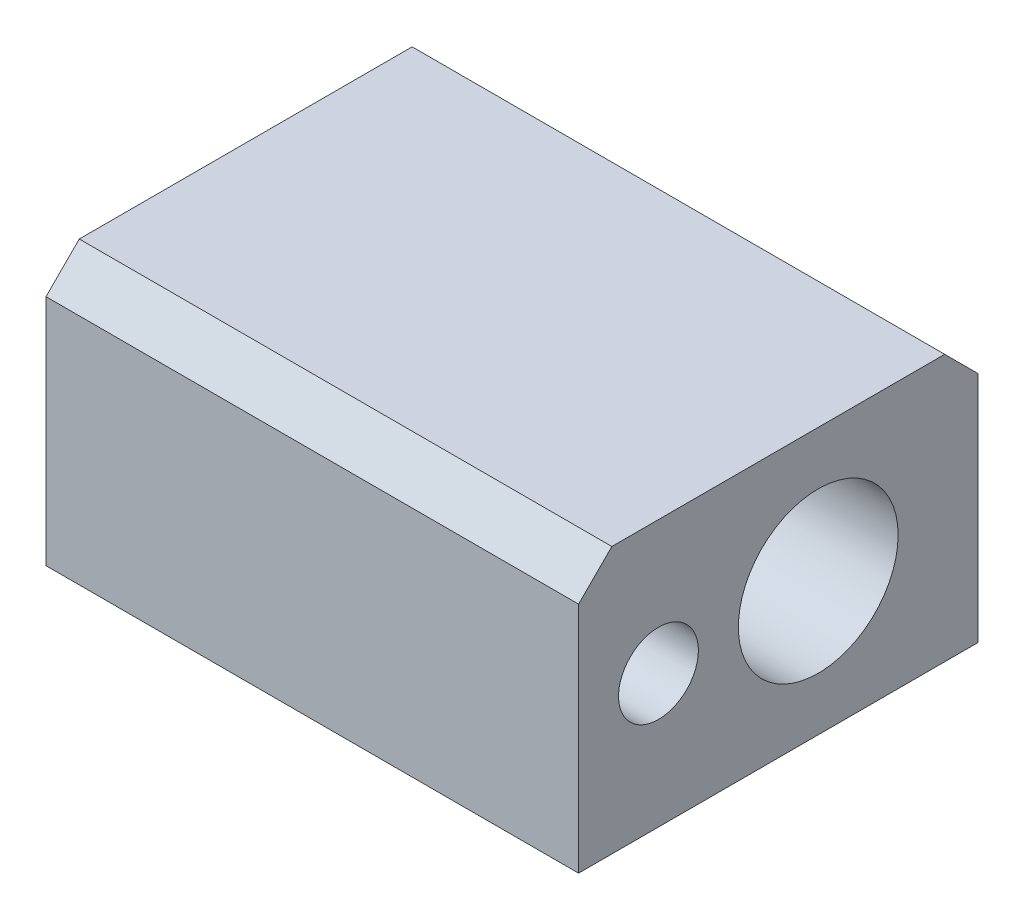
ISO-10303-21;
HEADER;
FILE_DESCRIPTION(('STEP AP214'),'2;1');
FILE_NAME('part.step','',(''),(''),'','','');
FILE_SCHEMA(('AUTOMOTIVE_DESIGN { 1 0 10303 214 1 1 1 1 }'));
ENDSEC;
DATA;
#1=APPLICATION_CONTEXT('core data for automotive mechanical design processes');
#2=APPLICATION_PROTOCOL_DEFINITION('international standard','automotive_design',2000,#1);
#3=PRODUCT_CONTEXT('',#1,'mechanical');
#4=PRODUCT('Part','Part','',(#3));
#5=PRODUCT_RELATED_PRODUCT_CATEGORY('part','',(#4));
#6=PRODUCT_DEFINITION_FORMATION('','',#4);
#7=PRODUCT_DEFINITION_CONTEXT('part definition',#1,'design');
#8=PRODUCT_DEFINITION('design','',#6,#7);
#9=PRODUCT_DEFINITION_SHAPE('','',#8);
#10=(LENGTH_UNIT() NAMED_UNIT(*) SI_UNIT(.MILLI.,.METRE.));
#11=(NAMED_UNIT(*) PLANE_ANGLE_UNIT() SI_UNIT($,.RADIAN.));
#12=(NAMED_UNIT(*) SI_UNIT($,.STERADIAN.) SOLID_ANGLE_UNIT());
#13=UNCERTAINTY_MEASURE_WITH_UNIT(LENGTH_MEASURE(1.E-05),#10,'distance_accuracy_value','');
#14=(GEOMETRIC_REPRESENTATION_CONTEXT(3) GLOBAL_UNCERTAINTY_ASSIGNED_CONTEXT((#13)) GLOBAL_UNIT_ASSIGNED_CONTEXT((#10,
#11,#12)) REPRESENTATION_CONTEXT('',''));
#15=CARTESIAN_POINT('',(0.,0.,0.));
#16=DIRECTION('',(0.,0.,1.));
#17=DIRECTION('',(1.,0.,0.));
#18=AXIS2_PLACEMENT_3D('',#15,#16,#17);
#19=CARTESIAN_POINT('',(101.6,0.,0.));
#20=DIRECTION('',(1.,0.,0.));
#21=DIRECTION('',(0.,0.,-1.));
#22=AXIS2_PLACEMENT_3D('',#19,#20,#21);
#23=PLANE('',#22);
#24=CARTESIAN_POINT('',(101.6,0.,-7.62000000000001));
#25=DIRECTION('',(1.,0.,0.));
#26=DIRECTION('',(0.,0.,-1.));
#27=AXIS2_PLACEMENT_3D('',#24,#25,#26);
#28=CIRCLE('',#27,15.24);
#29=CARTESIAN_POINT('',(101.6,0.,-22.86));
#30=VERTEX_POINT('',#29);
#31=EDGE_CURVE('E170',#30,#30,#28,.T.);
#32=ORIENTED_EDGE('',*,*,#31,.F.);
#33=EDGE_LOOP('',(#32));
#34=FACE_BOUND('',#33,.T.);
#35=DIRECTION('',(0.,1.,0.));
#36=VECTOR('',#35,1.);
#37=CARTESIAN_POINT('',(101.6,25.4,-38.1));
#38=LINE('',#37,#36);
#39=CARTESIAN_POINT('',(101.6,-25.4,-38.1));
#40=VERTEX_POINT('',#39);
#41=CARTESIAN_POINT('',(101.6,19.05,-38.1));
#42=VERTEX_POINT('',#41);
#43=EDGE_CURVE('E102',#40,#42,#38,.T.);
#44=ORIENTED_EDGE('',*,*,#43,.T.);
#45=DIRECTION('',(0.,-0.70710678118655,-0.707106781186545));
#46=VECTOR('',#45,1.);
#47=CARTESIAN_POINT('',(101.6,28.5749999999999,-28.5750000000001));
#48=LINE('',#47,#46);
#49=CARTESIAN_POINT('',(101.6,25.4,-31.75));
#50=VERTEX_POINT('',#49);
#51=EDGE_CURVE('E57',#42,#50,#48,.F.);
#52=ORIENTED_EDGE('',*,*,#51,.T.);
#53=DIRECTION('',(0.,0.,1.));
#54=VECTOR('',#53,1.);
#55=CARTESIAN_POINT('',(101.6,25.4,-38.1));
#56=LINE('',#55,#54);
#57=CARTESIAN_POINT('',(101.6,25.4,31.75));
#58=VERTEX_POINT('',#57);
#59=EDGE_CURVE('E110',#50,#58,#56,.T.);
#60=ORIENTED_EDGE('',*,*,#59,.T.);
#61=DIRECTION('',(0.,0.707106781186546,-0.707106781186549));
#62=VECTOR('',#61,1.);
#63=CARTESIAN_POINT('',(101.6,28.5750000000001,28.5749999999999));
#64=LINE('',#63,#62);
#65=CARTESIAN_POINT('',(101.6,19.05,38.1));
#66=VERTEX_POINT('',#65);
#67=EDGE_CURVE('E64',#58,#66,#64,.F.);
#68=ORIENTED_EDGE('',*,*,#67,.T.);
#69=DIRECTION('',(0.,-1.,0.));
#70=VECTOR('',#69,1.);
#71=CARTESIAN_POINT('',(101.6,25.4,38.1));
#72=LINE('',#71,#70);
#73=CARTESIAN_POINT('',(101.6,-25.4,38.1));
#74=VERTEX_POINT('',#73);
#75=EDGE_CURVE('E115',#66,#74,#72,.T.);
#76=ORIENTED_EDGE('',*,*,#75,.T.);
#77=DIRECTION('',(0.,0.,-1.));
#78=VECTOR('',#77,1.);
#79=CARTESIAN_POINT('',(101.6,-25.4,-38.1));
#80=LINE('',#79,#78);
#81=EDGE_CURVE('E111',#74,#40,#80,.T.);
#82=ORIENTED_EDGE('',*,*,#81,.T.);
#83=EDGE_LOOP('',(#44,#52,#60,#68,#76,#82));
#84=FACE_BOUND('',#83,.T.);
#85=CARTESIAN_POINT('',(101.6,0.,22.86));
#86=DIRECTION('',(1.,0.,0.));
#87=DIRECTION('',(0.,0.,-1.));
#88=AXIS2_PLACEMENT_3D('',#85,#86,#87);
#89=CIRCLE('',#88,7.62);
#90=CARTESIAN_POINT('',(101.6,0.,15.24));
#91=VERTEX_POINT('',#90);
#92=EDGE_CURVE('E271',#91,#91,#89,.T.);
#93=ORIENTED_EDGE('',*,*,#92,.F.);
#94=EDGE_LOOP('',(#93));
#95=FACE_BOUND('',#94,.T.);
#96=ADVANCED_FACE('F47',(#34,#84,#95),#23,.T.);
#97=CARTESIAN_POINT('',(0.,0.,0.));
#98=DIRECTION('',(1.,0.,0.));
#99=DIRECTION('',(0.,0.,-1.));
#100=AXIS2_PLACEMENT_3D('',#97,#98,#99);
#101=PLANE('',#100);
#102=DIRECTION('',(0.,0.,1.));
#103=VECTOR('',#102,1.);
#104=CARTESIAN_POINT('',(0.,25.4,-38.1));
#105=LINE('',#104,#103);
#106=CARTESIAN_POINT('',(0.,25.4,-31.75));
#107=VERTEX_POINT('',#106);
#108=CARTESIAN_POINT('',(0.,25.4,31.75));
#109=VERTEX_POINT('',#108);
#110=EDGE_CURVE('E164',#107,#109,#105,.T.);
#111=ORIENTED_EDGE('',*,*,#110,.F.);
#112=DIRECTION('',(0.,0.70710678118655,0.707106781186545));
#113=VECTOR('',#112,1.);
#114=CARTESIAN_POINT('',(0.,25.4,-31.75));
#115=LINE('',#114,#113);
#116=CARTESIAN_POINT('',(0.,19.05,-38.1));
#117=VERTEX_POINT('',#116);
#118=EDGE_CURVE('E142',#107,#117,#115,.F.);
#119=ORIENTED_EDGE('',*,*,#118,.T.);
#120=DIRECTION('',(0.,1.,0.));
#121=VECTOR('',#120,1.);
#122=CARTESIAN_POINT('',(0.,25.4,-38.1));
#123=LINE('',#122,#121);
#124=CARTESIAN_POINT('',(0.,-25.4,-38.1));
#125=VERTEX_POINT('',#124);
#126=EDGE_CURVE('E163',#125,#117,#123,.T.);
#127=ORIENTED_EDGE('',*,*,#126,.F.);
#128=DIRECTION('',(0.,0.,-1.));
#129=VECTOR('',#128,1.);
#130=CARTESIAN_POINT('',(0.,-25.4,-38.1));
#131=LINE('',#130,#129);
#132=CARTESIAN_POINT('',(0.,-25.4,38.1));
#133=VERTEX_POINT('',#132);
#134=EDGE_CURVE('E124',#133,#125,#131,.T.);
#135=ORIENTED_EDGE('',*,*,#134,.F.);
#136=DIRECTION('',(0.,-1.,0.));
#137=VECTOR('',#136,1.);
#138=CARTESIAN_POINT('',(0.,25.4,38.1));
#139=LINE('',#138,#137);
#140=CARTESIAN_POINT('',(0.,19.05,38.1));
#141=VERTEX_POINT('',#140);
#142=EDGE_CURVE('E120',#141,#133,#139,.T.);
#143=ORIENTED_EDGE('',*,*,#142,.F.);
#144=DIRECTION('',(0.,-0.707106781186546,0.707106781186549));
#145=VECTOR('',#144,1.);
#146=CARTESIAN_POINT('',(0.,19.05,38.1));
#147=LINE('',#146,#145);
#148=EDGE_CURVE('E139',#141,#109,#147,.F.);
#149=ORIENTED_EDGE('',*,*,#148,.T.);
#150=EDGE_LOOP('',(#111,#119,#127,#135,#143,#149));
#151=FACE_BOUND('',#150,.T.);
#152=CARTESIAN_POINT('',(0.,0.,-7.62000000000001));
#153=DIRECTION('',(1.,0.,0.));
#154=DIRECTION('',(0.,0.,-1.));
#155=AXIS2_PLACEMENT_3D('',#152,#153,#154);
#156=CIRCLE('',#155,15.24);
#157=CARTESIAN_POINT('',(0.,0.,-22.86));
#158=VERTEX_POINT('',#157);
#159=EDGE_CURVE('E279',#158,#158,#156,.T.);
#160=ORIENTED_EDGE('',*,*,#159,.T.);
#161=EDGE_LOOP('',(#160));
#162=FACE_BOUND('',#161,.T.);
#163=CARTESIAN_POINT('',(0.,0.,22.86));
#164=DIRECTION('',(1.,0.,0.));
#165=DIRECTION('',(0.,0.,-1.));
#166=AXIS2_PLACEMENT_3D('',#163,#164,#165);
#167=CIRCLE('',#166,7.62);
#168=CARTESIAN_POINT('',(0.,0.,15.24));
#169=VERTEX_POINT('',#168);
#170=EDGE_CURVE('E274',#169,#169,#167,.T.);
#171=ORIENTED_EDGE('',*,*,#170,.T.);
#172=EDGE_LOOP('',(#171));
#173=FACE_BOUND('',#172,.T.);
#174=ADVANCED_FACE('F161',(#151,#162,#173),#101,.F.);
#175=CARTESIAN_POINT('',(101.6,-25.4,-38.1));
#176=DIRECTION('',(0.,1.,0.));
#177=DIRECTION('',(0.,0.,1.));
#178=AXIS2_PLACEMENT_3D('',#175,#176,#177);
#179=PLANE('',#178);
#180=ORIENTED_EDGE('',*,*,#134,.T.);
#181=DIRECTION('',(-1.,0.,0.));
#182=VECTOR('',#181,1.);
#183=CARTESIAN_POINT('',(101.6,-25.4,-38.1));
#184=LINE('',#183,#182);
#185=EDGE_CURVE('E106',#40,#125,#184,.T.);
#186=ORIENTED_EDGE('',*,*,#185,.F.);
#187=ORIENTED_EDGE('',*,*,#81,.F.);
#188=DIRECTION('',(-1.,0.,0.));
#189=VECTOR('',#188,1.);
#190=CARTESIAN_POINT('',(101.6,-25.4,38.1));
#191=LINE('',#190,#189);
#192=EDGE_CURVE('E127',#74,#133,#191,.T.);
#193=ORIENTED_EDGE('',*,*,#192,.T.);
#194=EDGE_LOOP('',(#180,#186,#187,#193));
#195=FACE_BOUND('',#194,.T.);
#196=ADVANCED_FACE('F122',(#195),#179,.F.);
#197=CARTESIAN_POINT('',(101.6,25.4,-38.1));
#198=DIRECTION('',(0.,0.,1.));
#199=DIRECTION('',(0.,-1.,0.));
#200=AXIS2_PLACEMENT_3D('',#197,#198,#199);
#201=PLANE('',#200);
#202=ORIENTED_EDGE('',*,*,#126,.T.);
#203=DIRECTION('',(1.,0.,0.));
#204=VECTOR('',#203,1.);
#205=CARTESIAN_POINT('',(101.6,19.05,-38.1));
#206=LINE('',#205,#204);
#207=EDGE_CURVE('E72',#117,#42,#206,.T.);
#208=ORIENTED_EDGE('',*,*,#207,.T.);
#209=ORIENTED_EDGE('',*,*,#43,.F.);
#210=ORIENTED_EDGE('',*,*,#185,.T.);
#211=EDGE_LOOP('',(#202,#208,#209,#210));
#212=FACE_BOUND('',#211,.T.);
#213=ADVANCED_FACE('F104',(#212),#201,.F.);
#214=CARTESIAN_POINT('',(101.6,25.4,-38.1));
#215=DIRECTION('',(0.,-1.,0.));
#216=DIRECTION('',(0.,0.,-1.));
#217=AXIS2_PLACEMENT_3D('',#214,#215,#216);
#218=PLANE('',#217);
#219=ORIENTED_EDGE('',*,*,#59,.F.);
#220=DIRECTION('',(-1.,0.,0.));
#221=VECTOR('',#220,1.);
#222=CARTESIAN_POINT('',(101.6,25.4,-31.75));
#223=LINE('',#222,#221);
#224=EDGE_CURVE('E131',#50,#107,#223,.T.);
#225=ORIENTED_EDGE('',*,*,#224,.T.);
#226=ORIENTED_EDGE('',*,*,#110,.T.);
#227=DIRECTION('',(1.,0.,0.));
#228=VECTOR('',#227,1.);
#229=CARTESIAN_POINT('',(101.6,25.4,31.75));
#230=LINE('',#229,#228);
#231=EDGE_CURVE('E126',#109,#58,#230,.T.);
#232=ORIENTED_EDGE('',*,*,#231,.T.);
#233=EDGE_LOOP('',(#219,#225,#226,#232));
#234=FACE_BOUND('',#233,.T.);
#235=ADVANCED_FACE('F153',(#234),#218,.F.);
#236=CARTESIAN_POINT('',(101.6,25.4,38.1));
#237=DIRECTION('',(0.,0.,-1.));
#238=DIRECTION('',(-1.,0.,0.));
#239=AXIS2_PLACEMENT_3D('',#236,#237,#238);
#240=PLANE('',#239);
#241=ORIENTED_EDGE('',*,*,#75,.F.);
#242=DIRECTION('',(-1.,0.,0.));
#243=VECTOR('',#242,1.);
#244=CARTESIAN_POINT('',(101.6,19.05,38.1));
#245=LINE('',#244,#243);
#246=EDGE_CURVE('E11',#66,#141,#245,.T.);
#247=ORIENTED_EDGE('',*,*,#246,.T.);
#248=ORIENTED_EDGE('',*,*,#142,.T.);
#249=ORIENTED_EDGE('',*,*,#192,.F.);
#250=EDGE_LOOP('',(#241,#247,#248,#249));
#251=FACE_BOUND('',#250,.T.);
#252=ADVANCED_FACE('F176',(#251),#240,.F.);
#253=CARTESIAN_POINT('',(101.6,0.,-7.62000000000001));
#254=DIRECTION('',(-1.,0.,0.));
#255=DIRECTION('',(0.,0.,1.));
#256=AXIS2_PLACEMENT_3D('',#253,#254,#255);
#257=CYLINDRICAL_SURFACE('',#256,15.24);
#258=ORIENTED_EDGE('',*,*,#31,.T.);
#259=EDGE_LOOP('',(#258));
#260=FACE_BOUND('',#259,.T.);
#261=ORIENTED_EDGE('',*,*,#159,.F.);
#262=EDGE_LOOP('',(#261));
#263=FACE_BOUND('',#262,.T.);
#264=ADVANCED_FACE('F194',(#260,#263),#257,.F.);
#265=CARTESIAN_POINT('',(101.6,0.,22.86));
#266=DIRECTION('',(-1.,0.,0.));
#267=DIRECTION('',(0.,0.,1.));
#268=AXIS2_PLACEMENT_3D('',#265,#266,#267);
#269=CYLINDRICAL_SURFACE('',#268,7.62);
#270=ORIENTED_EDGE('',*,*,#92,.T.);
#271=EDGE_LOOP('',(#270));
#272=FACE_BOUND('',#271,.T.);
#273=ORIENTED_EDGE('',*,*,#170,.F.);
#274=EDGE_LOOP('',(#273));
#275=FACE_BOUND('',#274,.T.);
#276=ADVANCED_FACE('F183',(#272,#275),#269,.F.);
#277=CARTESIAN_POINT('',(101.6,25.4,-31.75));
#278=DIRECTION('',(0.,-0.707106781186545,0.70710678118655));
#279=DIRECTION('',(-1.,0.,0.));
#280=AXIS2_PLACEMENT_3D('',#277,#278,#279);
#281=PLANE('',#280);
#282=ORIENTED_EDGE('',*,*,#51,.F.);
#283=ORIENTED_EDGE('',*,*,#207,.F.);
#284=ORIENTED_EDGE('',*,*,#118,.F.);
#285=ORIENTED_EDGE('',*,*,#224,.F.);
#286=EDGE_LOOP('',(#282,#283,#284,#285));
#287=FACE_BOUND('',#286,.T.);
#288=ADVANCED_FACE('F159',(#287),#281,.F.);
#289=CARTESIAN_POINT('',(101.6,19.05,38.1));
#290=DIRECTION('',(0.,-0.707106781186549,-0.707106781186546));
#291=DIRECTION('',(-1.,0.,0.));
#292=AXIS2_PLACEMENT_3D('',#289,#290,#291);
#293=PLANE('',#292);
#294=ORIENTED_EDGE('',*,*,#67,.F.);
#295=ORIENTED_EDGE('',*,*,#231,.F.);
#296=ORIENTED_EDGE('',*,*,#148,.F.);
#297=ORIENTED_EDGE('',*,*,#246,.F.);
#298=EDGE_LOOP('',(#294,#295,#296,#297));
#299=FACE_BOUND('',#298,.T.);
#300=ADVANCED_FACE('F50',(#299),#293,.F.);
#301=CLOSED_SHELL('',(#96,#174,#196,#213,#235,#252,#264,#276,#288,#300));
#302=MANIFOLD_SOLID_BREP('B2',#301);
#303=ADVANCED_BREP_SHAPE_REPRESENTATION('',(#18,#302),#14);
#304=SHAPE_DEFINITION_REPRESENTATION(#9,#303);
ENDSEC;
END-ISO-10303-21;
